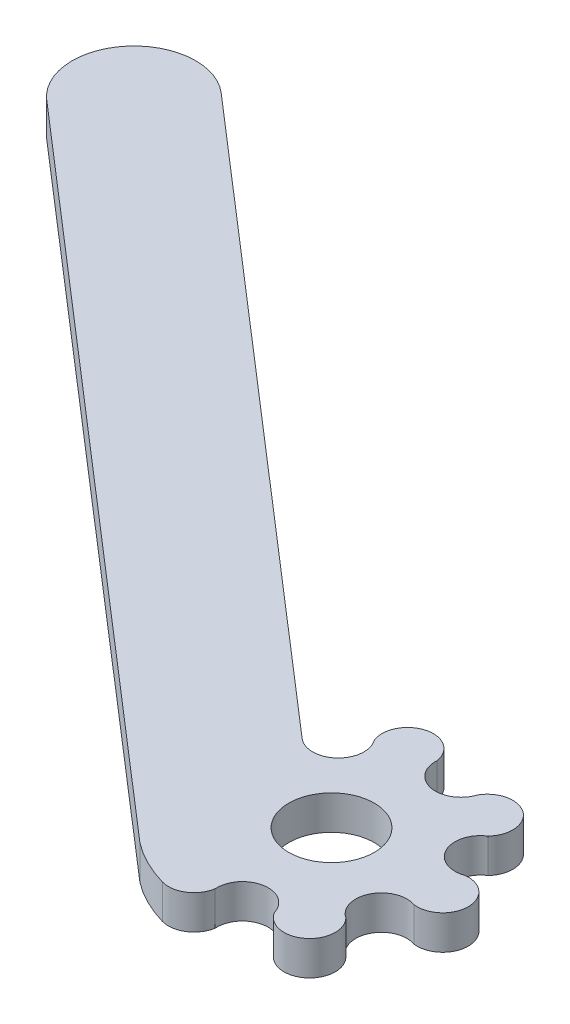
ISO-10303-21;
HEADER;
FILE_DESCRIPTION(('STEP AP214'),'2;1');
FILE_NAME('part.step','',(''),(''),'','','');
FILE_SCHEMA(('AUTOMOTIVE_DESIGN { 1 0 10303 214 1 1 1 1 }'));
ENDSEC;
DATA;
#1=APPLICATION_CONTEXT('core data for automotive mechanical design processes');
#2=APPLICATION_PROTOCOL_DEFINITION('international standard','automotive_design',2000,#1);
#3=PRODUCT_CONTEXT('',#1,'mechanical');
#4=PRODUCT('Part','Part','',(#3));
#5=PRODUCT_RELATED_PRODUCT_CATEGORY('part','',(#4));
#6=PRODUCT_DEFINITION_FORMATION('','',#4);
#7=PRODUCT_DEFINITION_CONTEXT('part definition',#1,'design');
#8=PRODUCT_DEFINITION('design','',#6,#7);
#9=PRODUCT_DEFINITION_SHAPE('','',#8);
#10=(LENGTH_UNIT() NAMED_UNIT(*) SI_UNIT(.MILLI.,.METRE.));
#11=(NAMED_UNIT(*) PLANE_ANGLE_UNIT() SI_UNIT($,.RADIAN.));
#12=(NAMED_UNIT(*) SI_UNIT($,.STERADIAN.) SOLID_ANGLE_UNIT());
#13=UNCERTAINTY_MEASURE_WITH_UNIT(LENGTH_MEASURE(1.E-05),#10,'distance_accuracy_value','');
#14=(GEOMETRIC_REPRESENTATION_CONTEXT(3) GLOBAL_UNCERTAINTY_ASSIGNED_CONTEXT((#13)) GLOBAL_UNIT_ASSIGNED_CONTEXT((#10,
#11,#12)) REPRESENTATION_CONTEXT('',''));
#15=CARTESIAN_POINT('',(0.,0.,0.));
#16=DIRECTION('',(0.,0.,1.));
#17=DIRECTION('',(1.,0.,0.));
#18=AXIS2_PLACEMENT_3D('',#15,#16,#17);
#19=CARTESIAN_POINT('',(0.,2.,0.));
#20=DIRECTION('',(0.,-1.,0.));
#21=DIRECTION('',(0.,0.,-1.));
#22=AXIS2_PLACEMENT_3D('',#19,#20,#21);
#23=CYLINDRICAL_SURFACE('',#22,8.);
#24=CARTESIAN_POINT('',(0.,0.,0.));
#25=DIRECTION('',(0.,1.,0.));
#26=DIRECTION('',(0.,0.,1.));
#27=AXIS2_PLACEMENT_3D('',#24,#25,#26);
#28=CIRCLE('',#27,8.);
#29=CARTESIAN_POINT('',(-4.8137979542884,0.,6.38962825642375));
#30=VERTEX_POINT('',#29);
#31=CARTESIAN_POINT('',(-2.20732879907371,0.,7.68945378897486));
#32=VERTEX_POINT('',#31);
#33=EDGE_CURVE('E167',#30,#32,#28,.T.);
#34=ORIENTED_EDGE('',*,*,#33,.T.);
#35=DIRECTION('',(0.,-1.,0.));
#36=VECTOR('',#35,1.);
#37=CARTESIAN_POINT('',(-2.20732879907371,2.,7.68945378897486));
#38=LINE('',#37,#36);
#39=CARTESIAN_POINT('',(-2.20732879907371,2.,7.68945378897486));
#40=VERTEX_POINT('',#39);
#41=EDGE_CURVE('E11',#40,#32,#38,.T.);
#42=ORIENTED_EDGE('',*,*,#41,.F.);
#43=CARTESIAN_POINT('',(0.,2.,0.));
#44=DIRECTION('',(0.,1.,0.));
#45=DIRECTION('',(0.,0.,1.));
#46=AXIS2_PLACEMENT_3D('',#43,#44,#45);
#47=CIRCLE('',#46,8.);
#48=CARTESIAN_POINT('',(-4.8137979542884,2.,6.38962825642375));
#49=VERTEX_POINT('',#48);
#50=EDGE_CURVE('E206',#49,#40,#47,.T.);
#51=ORIENTED_EDGE('',*,*,#50,.F.);
#52=DIRECTION('',(0.,-1.,0.));
#53=VECTOR('',#52,1.);
#54=CARTESIAN_POINT('',(-4.8137979542884,2.,6.38962825642375));
#55=LINE('',#54,#53);
#56=EDGE_CURVE('E51',#49,#30,#55,.T.);
#57=ORIENTED_EDGE('',*,*,#56,.T.);
#58=EDGE_LOOP('',(#34,#42,#51,#57));
#59=FACE_BOUND('',#58,.T.);
#60=ADVANCED_FACE('F35',(#59),#23,.T.);
#61=CARTESIAN_POINT('',(-1.79345464924739,2.,6.24768120354207));
#62=DIRECTION('',(0.,-1.,0.));
#63=DIRECTION('',(0.,0.,-1.));
#64=AXIS2_PLACEMENT_3D('',#61,#62,#63);
#65=CYLINDRICAL_SURFACE('',#64,1.5);
#66=CARTESIAN_POINT('',(-1.79345464924739,0.,6.24768120354207));
#67=DIRECTION('',(0.,1.,0.));
#68=DIRECTION('',(0.,0.,1.));
#69=AXIS2_PLACEMENT_3D('',#66,#67,#68);
#70=CIRCLE('',#69,1.5);
#71=CARTESIAN_POINT('',(-0.31355711189627,0.,6.49243266715792));
#72=VERTEX_POINT('',#71);
#73=EDGE_CURVE('E169',#32,#72,#70,.T.);
#74=ORIENTED_EDGE('',*,*,#73,.T.);
#75=DIRECTION('',(0.,-1.,0.));
#76=VECTOR('',#75,1.);
#77=CARTESIAN_POINT('',(-0.31355711189627,2.,6.49243266715792));
#78=LINE('',#77,#76);
#79=CARTESIAN_POINT('',(-0.31355711189627,2.,6.49243266715792));
#80=VERTEX_POINT('',#79);
#81=EDGE_CURVE('E43',#80,#72,#78,.T.);
#82=ORIENTED_EDGE('',*,*,#81,.F.);
#83=CARTESIAN_POINT('',(-1.79345464924739,2.,6.24768120354207));
#84=DIRECTION('',(0.,1.,0.));
#85=DIRECTION('',(0.,0.,1.));
#86=AXIS2_PLACEMENT_3D('',#83,#84,#85);
#87=CIRCLE('',#86,1.5);
#88=EDGE_CURVE('E108',#40,#80,#87,.T.);
#89=ORIENTED_EDGE('',*,*,#88,.F.);
#90=ORIENTED_EDGE('',*,*,#41,.T.);
#91=EDGE_LOOP('',(#74,#82,#89,#90));
#92=FACE_BOUND('',#91,.T.);
#93=ADVANCED_FACE('F231',(#92),#65,.T.);
#94=CARTESIAN_POINT('',(1.18291582575867,2.,6.38962825642375));
#95=DIRECTION('',(0.,-1.,0.));
#96=DIRECTION('',(0.,0.,-1.));
#97=AXIS2_PLACEMENT_3D('',#94,#95,#96);
#98=CYLINDRICAL_SURFACE('',#97,1.5);
#99=CARTESIAN_POINT('',(1.18291582575867,0.,6.38962825642375));
#100=DIRECTION('',(0.,1.,0.));
#101=DIRECTION('',(0.,0.,1.));
#102=AXIS2_PLACEMENT_3D('',#99,#100,#101);
#103=CIRCLE('',#102,1.5);
#104=CARTESIAN_POINT('',(2.61701281560819,0.,5.94989444636983));
#105=VERTEX_POINT('',#104);
#106=EDGE_CURVE('E173',#105,#72,#103,.T.);
#107=ORIENTED_EDGE('',*,*,#106,.F.);
#108=DIRECTION('',(0.,-1.,0.));
#109=VECTOR('',#108,1.);
#110=CARTESIAN_POINT('',(2.61701281560819,2.,5.94989444636983));
#111=LINE('',#110,#109);
#112=CARTESIAN_POINT('',(2.61701281560819,2.,5.94989444636983));
#113=VERTEX_POINT('',#112);
#114=EDGE_CURVE('E224',#113,#105,#111,.T.);
#115=ORIENTED_EDGE('',*,*,#114,.F.);
#116=CARTESIAN_POINT('',(1.18291582575867,2.,6.38962825642375));
#117=DIRECTION('',(0.,1.,0.));
#118=DIRECTION('',(0.,0.,1.));
#119=AXIS2_PLACEMENT_3D('',#116,#117,#118);
#120=CIRCLE('',#119,1.5);
#121=EDGE_CURVE('E230',#113,#80,#120,.T.);
#122=ORIENTED_EDGE('',*,*,#121,.T.);
#123=ORIENTED_EDGE('',*,*,#81,.T.);
#124=EDGE_LOOP('',(#107,#115,#122,#123));
#125=FACE_BOUND('',#124,.T.);
#126=ADVANCED_FACE('F228',(#125),#98,.F.);
#127=CARTESIAN_POINT('',(3.91121083785932,2.,5.1915729583443));
#128=DIRECTION('',(0.,-1.,0.));
#129=DIRECTION('',(0.,0.,-1.));
#130=AXIS2_PLACEMENT_3D('',#127,#128,#129);
#131=CYLINDRICAL_SURFACE('',#130,1.5);
#132=CARTESIAN_POINT('',(3.91121083785932,0.,5.1915729583443));
#133=DIRECTION('',(0.,1.,0.));
#134=DIRECTION('',(0.,0.,1.));
#135=AXIS2_PLACEMENT_3D('',#132,#133,#134);
#136=CIRCLE('',#135,1.5);
#137=CARTESIAN_POINT('',(4.9971195255499,0.,4.15677717076197));
#138=VERTEX_POINT('',#137);
#139=EDGE_CURVE('E176',#105,#138,#136,.T.);
#140=ORIENTED_EDGE('',*,*,#139,.T.);
#141=DIRECTION('',(0.,-1.,0.));
#142=VECTOR('',#141,1.);
#143=CARTESIAN_POINT('',(4.9971195255499,2.,4.15677717076197));
#144=LINE('',#143,#142);
#145=CARTESIAN_POINT('',(4.9971195255499,2.,4.15677717076197));
#146=VERTEX_POINT('',#145);
#147=EDGE_CURVE('E222',#146,#138,#144,.T.);
#148=ORIENTED_EDGE('',*,*,#147,.F.);
#149=CARTESIAN_POINT('',(3.91121083785932,2.,5.1915729583443));
#150=DIRECTION('',(0.,1.,0.));
#151=DIRECTION('',(0.,0.,1.));
#152=AXIS2_PLACEMENT_3D('',#149,#150,#151);
#153=CIRCLE('',#152,1.5);
#154=EDGE_CURVE('E243',#113,#146,#153,.T.);
#155=ORIENTED_EDGE('',*,*,#154,.F.);
#156=ORIENTED_EDGE('',*,*,#114,.T.);
#157=EDGE_LOOP('',(#140,#148,#155,#156));
#158=FACE_BOUND('',#157,.T.);
#159=ADVANCED_FACE('F240',(#158),#131,.T.);
#160=CARTESIAN_POINT('',(5.81690942193901,2.,2.90061455160061));
#161=DIRECTION('',(0.,-1.,0.));
#162=DIRECTION('',(0.,0.,-1.));
#163=AXIS2_PLACEMENT_3D('',#160,#161,#162);
#164=CYLINDRICAL_SURFACE('',#163,1.5);
#165=CARTESIAN_POINT('',(5.81690942193901,0.,2.90061455160061));
#166=DIRECTION('',(0.,1.,0.));
#167=DIRECTION('',(0.,0.,1.));
#168=AXIS2_PLACEMENT_3D('',#165,#166,#167);
#169=CIRCLE('',#168,1.5);
#170=CARTESIAN_POINT('',(6.32692307692308,0.,1.48998133501673));
#171=VERTEX_POINT('',#170);
#172=EDGE_CURVE('E179',#171,#138,#169,.T.);
#173=ORIENTED_EDGE('',*,*,#172,.F.);
#174=DIRECTION('',(0.,-1.,0.));
#175=VECTOR('',#174,1.);
#176=CARTESIAN_POINT('',(6.32692307692308,2.,1.48998133501673));
#177=LINE('',#176,#175);
#178=CARTESIAN_POINT('',(6.32692307692308,2.,1.48998133501673));
#179=VERTEX_POINT('',#178);
#180=EDGE_CURVE('E220',#179,#171,#177,.T.);
#181=ORIENTED_EDGE('',*,*,#180,.F.);
#182=CARTESIAN_POINT('',(5.81690942193901,2.,2.90061455160061));
#183=DIRECTION('',(0.,1.,0.));
#184=DIRECTION('',(0.,0.,1.));
#185=AXIS2_PLACEMENT_3D('',#182,#183,#184);
#186=CIRCLE('',#185,1.5);
#187=EDGE_CURVE('E245',#179,#146,#186,.T.);
#188=ORIENTED_EDGE('',*,*,#187,.T.);
#189=ORIENTED_EDGE('',*,*,#147,.T.);
#190=EDGE_LOOP('',(#173,#181,#188,#189));
#191=FACE_BOUND('',#190,.T.);
#192=ADVANCED_FACE('F381',(#191),#164,.F.);
#193=CARTESIAN_POINT('',(6.5,2.,0.));
#194=DIRECTION('',(0.,-1.,0.));
#195=DIRECTION('',(0.,0.,-1.));
#196=AXIS2_PLACEMENT_3D('',#193,#194,#195);
#197=CYLINDRICAL_SURFACE('',#196,1.5);
#198=CARTESIAN_POINT('',(6.5,0.,0.));
#199=DIRECTION('',(0.,1.,0.));
#200=DIRECTION('',(0.,0.,1.));
#201=AXIS2_PLACEMENT_3D('',#198,#199,#200);
#202=CIRCLE('',#201,1.5);
#203=CARTESIAN_POINT('',(6.32692307692308,0.,-1.48998133501672));
#204=VERTEX_POINT('',#203);
#205=EDGE_CURVE('E182',#171,#204,#202,.T.);
#206=ORIENTED_EDGE('',*,*,#205,.T.);
#207=DIRECTION('',(0.,-1.,0.));
#208=VECTOR('',#207,1.);
#209=CARTESIAN_POINT('',(6.32692307692308,2.,-1.48998133501672));
#210=LINE('',#209,#208);
#211=CARTESIAN_POINT('',(6.32692307692308,2.,-1.48998133501672));
#212=VERTEX_POINT('',#211);
#213=EDGE_CURVE('E218',#212,#204,#210,.T.);
#214=ORIENTED_EDGE('',*,*,#213,.F.);
#215=CARTESIAN_POINT('',(6.5,2.,0.));
#216=DIRECTION('',(0.,1.,0.));
#217=DIRECTION('',(0.,0.,1.));
#218=AXIS2_PLACEMENT_3D('',#215,#216,#217);
#219=CIRCLE('',#218,1.5);
#220=EDGE_CURVE('E252',#179,#212,#219,.T.);
#221=ORIENTED_EDGE('',*,*,#220,.F.);
#222=ORIENTED_EDGE('',*,*,#180,.T.);
#223=EDGE_LOOP('',(#206,#214,#221,#222));
#224=FACE_BOUND('',#223,.T.);
#225=ADVANCED_FACE('F371',(#224),#197,.T.);
#226=CARTESIAN_POINT('',(5.81690942193901,2.,-2.90061455160061));
#227=DIRECTION('',(0.,-1.,0.));
#228=DIRECTION('',(0.,0.,-1.));
#229=AXIS2_PLACEMENT_3D('',#226,#227,#228);
#230=CYLINDRICAL_SURFACE('',#229,1.5);
#231=CARTESIAN_POINT('',(5.81690942193901,0.,-2.90061455160061));
#232=DIRECTION('',(0.,1.,0.));
#233=DIRECTION('',(0.,0.,1.));
#234=AXIS2_PLACEMENT_3D('',#231,#232,#233);
#235=CIRCLE('',#234,1.5);
#236=CARTESIAN_POINT('',(4.9971195255499,0.,-4.15677717076198));
#237=VERTEX_POINT('',#236);
#238=EDGE_CURVE('E185',#237,#204,#235,.T.);
#239=ORIENTED_EDGE('',*,*,#238,.F.);
#240=DIRECTION('',(0.,-1.,0.));
#241=VECTOR('',#240,1.);
#242=CARTESIAN_POINT('',(4.9971195255499,2.,-4.15677717076198));
#243=LINE('',#242,#241);
#244=CARTESIAN_POINT('',(4.9971195255499,2.,-4.15677717076198));
#245=VERTEX_POINT('',#244);
#246=EDGE_CURVE('E216',#245,#237,#243,.T.);
#247=ORIENTED_EDGE('',*,*,#246,.F.);
#248=CARTESIAN_POINT('',(5.81690942193901,2.,-2.90061455160061));
#249=DIRECTION('',(0.,1.,0.));
#250=DIRECTION('',(0.,0.,1.));
#251=AXIS2_PLACEMENT_3D('',#248,#249,#250);
#252=CIRCLE('',#251,1.5);
#253=EDGE_CURVE('E254',#245,#212,#252,.T.);
#254=ORIENTED_EDGE('',*,*,#253,.T.);
#255=ORIENTED_EDGE('',*,*,#213,.T.);
#256=EDGE_LOOP('',(#239,#247,#254,#255));
#257=FACE_BOUND('',#256,.T.);
#258=ADVANCED_FACE('F361',(#257),#230,.F.);
#259=CARTESIAN_POINT('',(3.91121083785932,2.,-5.1915729583443));
#260=DIRECTION('',(0.,-1.,0.));
#261=DIRECTION('',(0.,0.,-1.));
#262=AXIS2_PLACEMENT_3D('',#259,#260,#261);
#263=CYLINDRICAL_SURFACE('',#262,1.5);
#264=CARTESIAN_POINT('',(3.91121083785932,0.,-5.1915729583443));
#265=DIRECTION('',(0.,1.,0.));
#266=DIRECTION('',(0.,0.,1.));
#267=AXIS2_PLACEMENT_3D('',#264,#265,#266);
#268=CIRCLE('',#267,1.5);
#269=CARTESIAN_POINT('',(2.61701281560819,0.,-5.94989444636983));
#270=VERTEX_POINT('',#269);
#271=EDGE_CURVE('E188',#237,#270,#268,.T.);
#272=ORIENTED_EDGE('',*,*,#271,.T.);
#273=DIRECTION('',(0.,-1.,0.));
#274=VECTOR('',#273,1.);
#275=CARTESIAN_POINT('',(2.61701281560819,2.,-5.94989444636983));
#276=LINE('',#275,#274);
#277=CARTESIAN_POINT('',(2.61701281560819,2.,-5.94989444636983));
#278=VERTEX_POINT('',#277);
#279=EDGE_CURVE('E214',#278,#270,#276,.T.);
#280=ORIENTED_EDGE('',*,*,#279,.F.);
#281=CARTESIAN_POINT('',(3.91121083785932,2.,-5.1915729583443));
#282=DIRECTION('',(0.,1.,0.));
#283=DIRECTION('',(0.,0.,1.));
#284=AXIS2_PLACEMENT_3D('',#281,#282,#283);
#285=CIRCLE('',#284,1.5);
#286=EDGE_CURVE('E257',#245,#278,#285,.T.);
#287=ORIENTED_EDGE('',*,*,#286,.F.);
#288=ORIENTED_EDGE('',*,*,#246,.T.);
#289=EDGE_LOOP('',(#272,#280,#287,#288));
#290=FACE_BOUND('',#289,.T.);
#291=ADVANCED_FACE('F351',(#290),#263,.T.);
#292=CARTESIAN_POINT('',(1.18344724696372,2.,-6.39135765026915));
#293=DIRECTION('',(0.,-1.,0.));
#294=DIRECTION('',(0.,0.,-1.));
#295=AXIS2_PLACEMENT_3D('',#292,#293,#294);
#296=CYLINDRICAL_SURFACE('',#295,1.5);
#297=CARTESIAN_POINT('',(1.18344724696372,0.,-6.39135765026915));
#298=DIRECTION('',(0.,1.,0.));
#299=DIRECTION('',(0.,0.,1.));
#300=AXIS2_PLACEMENT_3D('',#297,#298,#299);
#301=CIRCLE('',#300,1.5);
#302=CARTESIAN_POINT('',(-0.313142139566396,0.,-6.4924526952784));
#303=VERTEX_POINT('',#302);
#304=EDGE_CURVE('E191',#303,#270,#301,.T.);
#305=ORIENTED_EDGE('',*,*,#304,.F.);
#306=DIRECTION('',(0.,-1.,0.));
#307=VECTOR('',#306,1.);
#308=CARTESIAN_POINT('',(-0.313142139566396,2.,-6.4924526952784));
#309=LINE('',#308,#307);
#310=CARTESIAN_POINT('',(-0.313142139566396,2.,-6.4924526952784));
#311=VERTEX_POINT('',#310);
#312=EDGE_CURVE('E212',#311,#303,#309,.T.);
#313=ORIENTED_EDGE('',*,*,#312,.F.);
#314=CARTESIAN_POINT('',(1.18344724696372,2.,-6.39135765026915));
#315=DIRECTION('',(0.,1.,0.));
#316=DIRECTION('',(0.,0.,1.));
#317=AXIS2_PLACEMENT_3D('',#314,#315,#316);
#318=CIRCLE('',#317,1.5);
#319=EDGE_CURVE('E259',#311,#278,#318,.T.);
#320=ORIENTED_EDGE('',*,*,#319,.T.);
#321=ORIENTED_EDGE('',*,*,#279,.T.);
#322=EDGE_LOOP('',(#305,#313,#320,#321));
#323=FACE_BOUND('',#322,.T.);
#324=ADVANCED_FACE('F341',(#323),#296,.F.);
#325=CARTESIAN_POINT('',(-1.79305531748055,2.,-6.24779582160419));
#326=DIRECTION('',(0.,-1.,0.));
#327=DIRECTION('',(0.,0.,-1.));
#328=AXIS2_PLACEMENT_3D('',#325,#326,#327);
#329=CYLINDRICAL_SURFACE('',#328,1.5);
#330=CARTESIAN_POINT('',(-1.79305531748055,0.,-6.24779582160419));
#331=DIRECTION('',(0.,1.,0.));
#332=DIRECTION('',(0.,0.,1.));
#333=AXIS2_PLACEMENT_3D('',#330,#331,#332);
#334=CIRCLE('',#333,1.5);
#335=CARTESIAN_POINT('',(-3.17748034239277,0.,-5.67041609352502));
#336=VERTEX_POINT('',#335);
#337=EDGE_CURVE('E194',#303,#336,#334,.T.);
#338=ORIENTED_EDGE('',*,*,#337,.T.);
#339=DIRECTION('',(0.,-1.,0.));
#340=VECTOR('',#339,1.);
#341=CARTESIAN_POINT('',(-3.17748034239277,2.,-5.67041609352502));
#342=LINE('',#341,#340);
#343=CARTESIAN_POINT('',(-3.17748034239277,2.,-5.67041609352502));
#344=VERTEX_POINT('',#343);
#345=EDGE_CURVE('E210',#344,#336,#342,.T.);
#346=ORIENTED_EDGE('',*,*,#345,.F.);
#347=CARTESIAN_POINT('',(-1.79305531748055,2.,-6.24779582160419));
#348=DIRECTION('',(0.,1.,0.));
#349=DIRECTION('',(0.,0.,1.));
#350=AXIS2_PLACEMENT_3D('',#347,#348,#349);
#351=CIRCLE('',#350,1.5);
#352=EDGE_CURVE('E262',#311,#344,#351,.T.);
#353=ORIENTED_EDGE('',*,*,#352,.F.);
#354=ORIENTED_EDGE('',*,*,#312,.T.);
#355=EDGE_LOOP('',(#338,#346,#353,#354));
#356=FACE_BOUND('',#355,.T.);
#357=ADVANCED_FACE('F332',(#356),#329,.T.);
#358=CARTESIAN_POINT('',(-4.39269043782846,2.,-4.79106154389717));
#359=DIRECTION('',(0.,-1.,0.));
#360=DIRECTION('',(0.,0.,-1.));
#361=AXIS2_PLACEMENT_3D('',#358,#359,#360);
#362=CYLINDRICAL_SURFACE('',#361,1.5);
#363=CARTESIAN_POINT('',(-4.39269043782846,0.,-4.79106154389717));
#364=DIRECTION('',(0.,1.,0.));
#365=DIRECTION('',(0.,0.,1.));
#366=AXIS2_PLACEMENT_3D('',#363,#364,#365);
#367=CIRCLE('',#366,1.5);
#368=CARTESIAN_POINT('',(-5.37397027326146,0.,-3.65656170494937));
#369=VERTEX_POINT('',#368);
#370=EDGE_CURVE('E197',#369,#336,#367,.T.);
#371=ORIENTED_EDGE('',*,*,#370,.F.);
#372=DIRECTION('',(0.,-1.,0.));
#373=VECTOR('',#372,1.);
#374=CARTESIAN_POINT('',(-5.37397027326146,2.,-3.65656170494937));
#375=LINE('',#374,#373);
#376=CARTESIAN_POINT('',(-5.37397027326146,2.,-3.65656170494937));
#377=VERTEX_POINT('',#376);
#378=EDGE_CURVE('E159',#377,#369,#375,.T.);
#379=ORIENTED_EDGE('',*,*,#378,.F.);
#380=CARTESIAN_POINT('',(-4.39269043782846,2.,-4.79106154389717));
#381=DIRECTION('',(0.,1.,0.));
#382=DIRECTION('',(0.,0.,1.));
#383=AXIS2_PLACEMENT_3D('',#380,#381,#382);
#384=CIRCLE('',#383,1.5);
#385=EDGE_CURVE('E149',#377,#344,#384,.T.);
#386=ORIENTED_EDGE('',*,*,#385,.T.);
#387=ORIENTED_EDGE('',*,*,#345,.T.);
#388=EDGE_LOOP('',(#371,#379,#386,#387));
#389=FACE_BOUND('',#388,.T.);
#390=ADVANCED_FACE('F265',(#389),#362,.F.);
#391=CARTESIAN_POINT('',(-5.37397027326146,2.,-3.65656170494937));
#392=DIRECTION('',(-0.654186556955328,0.,0.756333225965205));
#393=DIRECTION('',(0.756333225965205,0.,0.654186556955327));
#394=AXIS2_PLACEMENT_3D('',#391,#392,#393);
#395=PLANE('',#394);
#396=DIRECTION('',(-0.756333225965205,0.,-0.654186556955327));
#397=VECTOR('',#396,1.);
#398=CARTESIAN_POINT('',(-5.37397027326146,0.,-3.65656170494937));
#399=LINE('',#398,#397);
#400=CARTESIAN_POINT('',(-40.455802454833,0.,-34.0004130903739));
#401=VERTEX_POINT('',#400);
#402=EDGE_CURVE('E156',#369,#401,#399,.T.);
#403=ORIENTED_EDGE('',*,*,#402,.T.);
#404=DIRECTION('',(0.,-1.,0.));
#405=VECTOR('',#404,1.);
#406=CARTESIAN_POINT('',(-40.455802454833,2.,-34.0004130903739));
#407=LINE('',#406,#405);
#408=CARTESIAN_POINT('',(-40.455802454833,2.,-34.0004130903739));
#409=VERTEX_POINT('',#408);
#410=EDGE_CURVE('E153',#409,#401,#407,.T.);
#411=ORIENTED_EDGE('',*,*,#410,.F.);
#412=DIRECTION('',(-0.756333225965205,0.,-0.654186556955327));
#413=VECTOR('',#412,1.);
#414=CARTESIAN_POINT('',(-5.37397027326146,2.,-3.65656170494937));
#415=LINE('',#414,#413);
#416=EDGE_CURVE('E142',#377,#409,#415,.T.);
#417=ORIENTED_EDGE('',*,*,#416,.F.);
#418=ORIENTED_EDGE('',*,*,#378,.T.);
#419=EDGE_LOOP('',(#403,#411,#417,#418));
#420=FACE_BOUND('',#419,.T.);
#421=ADVANCED_FACE('F154',(#420),#395,.F.);
#422=CARTESIAN_POINT('',(-42.8212789171748,2.,-31.2655839736853));
#423=DIRECTION('',(0.,-1.,0.));
#424=DIRECTION('',(0.,0.,-1.));
#425=AXIS2_PLACEMENT_3D('',#422,#423,#424);
#426=CYLINDRICAL_SURFACE('',#425,3.61590503074696);
#427=CARTESIAN_POINT('',(-42.8212789171748,0.,-31.2655839736853));
#428=DIRECTION('',(0.,1.,0.));
#429=DIRECTION('',(0.,0.,1.));
#430=AXIS2_PLACEMENT_3D('',#427,#428,#429);
#431=CIRCLE('',#430,3.61590503074696);
#432=CARTESIAN_POINT('',(-45.1867553795166,0.,-28.5307548569966));
#433=VERTEX_POINT('',#432);
#434=EDGE_CURVE('E201',#401,#433,#431,.T.);
#435=ORIENTED_EDGE('',*,*,#434,.T.);
#436=DIRECTION('',(0.,-1.,0.));
#437=VECTOR('',#436,1.);
#438=CARTESIAN_POINT('',(-45.1867553795166,2.,-28.5307548569966));
#439=LINE('',#438,#437);
#440=CARTESIAN_POINT('',(-45.1867553795166,2.,-28.5307548569966));
#441=VERTEX_POINT('',#440);
#442=EDGE_CURVE('E96',#441,#433,#439,.T.);
#443=ORIENTED_EDGE('',*,*,#442,.F.);
#444=CARTESIAN_POINT('',(-42.8212789171748,2.,-31.2655839736853));
#445=DIRECTION('',(0.,1.,0.));
#446=DIRECTION('',(0.,0.,1.));
#447=AXIS2_PLACEMENT_3D('',#444,#445,#446);
#448=CIRCLE('',#447,3.61590503074696);
#449=EDGE_CURVE('E147',#409,#441,#448,.T.);
#450=ORIENTED_EDGE('',*,*,#449,.F.);
#451=ORIENTED_EDGE('',*,*,#410,.T.);
#452=EDGE_LOOP('',(#435,#443,#450,#451));
#453=FACE_BOUND('',#452,.T.);
#454=ADVANCED_FACE('F161',(#453),#426,.T.);
#455=CARTESIAN_POINT('',(-4.8137979542884,2.,6.38962825642375));
#456=DIRECTION('',(-0.654186556955328,0.,0.756333225965205));
#457=DIRECTION('',(0.756333225965205,0.,0.654186556955328));
#458=AXIS2_PLACEMENT_3D('',#455,#456,#457);
#459=PLANE('',#458);
#460=DIRECTION('',(-0.756333225965205,0.,-0.654186556955328));
#461=VECTOR('',#460,1.);
#462=CARTESIAN_POINT('',(-4.8137979542884,0.,6.38962825642375));
#463=LINE('',#462,#461);
#464=EDGE_CURVE('E203',#30,#433,#463,.T.);
#465=ORIENTED_EDGE('',*,*,#464,.F.);
#466=ORIENTED_EDGE('',*,*,#56,.F.);
#467=DIRECTION('',(-0.756333225965205,0.,-0.654186556955328));
#468=VECTOR('',#467,1.);
#469=CARTESIAN_POINT('',(-4.8137979542884,2.,6.38962825642375));
#470=LINE('',#469,#468);
#471=EDGE_CURVE('E162',#49,#441,#470,.T.);
#472=ORIENTED_EDGE('',*,*,#471,.T.);
#473=ORIENTED_EDGE('',*,*,#442,.T.);
#474=EDGE_LOOP('',(#465,#466,#472,#473));
#475=FACE_BOUND('',#474,.T.);
#476=ADVANCED_FACE('F268',(#475),#459,.T.);
#477=CARTESIAN_POINT('',(0.,2.,0.));
#478=DIRECTION('',(0.,1.,0.));
#479=DIRECTION('',(0.,0.,1.));
#480=AXIS2_PLACEMENT_3D('',#477,#478,#479);
#481=PLANE('',#480);
#482=CARTESIAN_POINT('',(0.,2.,0.));
#483=DIRECTION('',(0.,1.,0.));
#484=DIRECTION('',(0.,0.,1.));
#485=AXIS2_PLACEMENT_3D('',#482,#483,#484);
#486=CIRCLE('',#485,2.5);
#487=CARTESIAN_POINT('',(0.,2.,2.5));
#488=VERTEX_POINT('',#487);
#489=EDGE_CURVE('E284',#488,#488,#486,.T.);
#490=ORIENTED_EDGE('',*,*,#489,.F.);
#491=EDGE_LOOP('',(#490));
#492=FACE_BOUND('',#491,.T.);
#493=ORIENTED_EDGE('',*,*,#50,.T.);
#494=ORIENTED_EDGE('',*,*,#88,.T.);
#495=ORIENTED_EDGE('',*,*,#121,.F.);
#496=ORIENTED_EDGE('',*,*,#154,.T.);
#497=ORIENTED_EDGE('',*,*,#187,.F.);
#498=ORIENTED_EDGE('',*,*,#220,.T.);
#499=ORIENTED_EDGE('',*,*,#253,.F.);
#500=ORIENTED_EDGE('',*,*,#286,.T.);
#501=ORIENTED_EDGE('',*,*,#319,.F.);
#502=ORIENTED_EDGE('',*,*,#352,.T.);
#503=ORIENTED_EDGE('',*,*,#385,.F.);
#504=ORIENTED_EDGE('',*,*,#416,.T.);
#505=ORIENTED_EDGE('',*,*,#449,.T.);
#506=ORIENTED_EDGE('',*,*,#471,.F.);
#507=EDGE_LOOP('',(#493,#494,#495,#496,#497,#498,#499,#500,#501,#502,#503,#504,#505,#506));
#508=FACE_BOUND('',#507,.T.);
#509=ADVANCED_FACE('F144',(#492,#508),#481,.T.);
#510=CARTESIAN_POINT('',(0.,0.,0.));
#511=DIRECTION('',(0.,1.,0.));
#512=DIRECTION('',(0.,0.,1.));
#513=AXIS2_PLACEMENT_3D('',#510,#511,#512);
#514=PLANE('',#513);
#515=CARTESIAN_POINT('',(0.,0.,0.));
#516=DIRECTION('',(0.,1.,0.));
#517=DIRECTION('',(0.,0.,1.));
#518=AXIS2_PLACEMENT_3D('',#515,#516,#517);
#519=CIRCLE('',#518,2.5);
#520=CARTESIAN_POINT('',(0.,0.,2.5));
#521=VERTEX_POINT('',#520);
#522=EDGE_CURVE('E170',#521,#521,#519,.T.);
#523=ORIENTED_EDGE('',*,*,#522,.T.);
#524=EDGE_LOOP('',(#523));
#525=FACE_BOUND('',#524,.T.);
#526=ORIENTED_EDGE('',*,*,#33,.F.);
#527=ORIENTED_EDGE('',*,*,#464,.T.);
#528=ORIENTED_EDGE('',*,*,#434,.F.);
#529=ORIENTED_EDGE('',*,*,#402,.F.);
#530=ORIENTED_EDGE('',*,*,#370,.T.);
#531=ORIENTED_EDGE('',*,*,#337,.F.);
#532=ORIENTED_EDGE('',*,*,#304,.T.);
#533=ORIENTED_EDGE('',*,*,#271,.F.);
#534=ORIENTED_EDGE('',*,*,#238,.T.);
#535=ORIENTED_EDGE('',*,*,#205,.F.);
#536=ORIENTED_EDGE('',*,*,#172,.T.);
#537=ORIENTED_EDGE('',*,*,#139,.F.);
#538=ORIENTED_EDGE('',*,*,#106,.T.);
#539=ORIENTED_EDGE('',*,*,#73,.F.);
#540=EDGE_LOOP('',(#526,#527,#528,#529,#530,#531,#532,#533,#534,#535,#536,#537,#538,#539));
#541=FACE_BOUND('',#540,.T.);
#542=ADVANCED_FACE('F235',(#525,#541),#514,.F.);
#543=CARTESIAN_POINT('',(0.,0.,0.));
#544=DIRECTION('',(0.,1.,0.));
#545=DIRECTION('',(0.,0.,1.));
#546=AXIS2_PLACEMENT_3D('',#543,#544,#545);
#547=CYLINDRICAL_SURFACE('',#546,2.5);
#548=ORIENTED_EDGE('',*,*,#522,.F.);
#549=EDGE_LOOP('',(#548));
#550=FACE_BOUND('',#549,.T.);
#551=ORIENTED_EDGE('',*,*,#489,.T.);
#552=EDGE_LOOP('',(#551));
#553=FACE_BOUND('',#552,.T.);
#554=ADVANCED_FACE('F291',(#550,#553),#547,.F.);
#555=CLOSED_SHELL('',(#60,#93,#126,#159,#192,#225,#258,#291,#324,#357,#390,#421,#454,#476,#509,
#542,#554));
#556=MANIFOLD_SOLID_BREP('B2',#555);
#557=ADVANCED_BREP_SHAPE_REPRESENTATION('',(#18,#556),#14);
#558=SHAPE_DEFINITION_REPRESENTATION(#9,#557);
ENDSEC;
END-ISO-10303-21;
